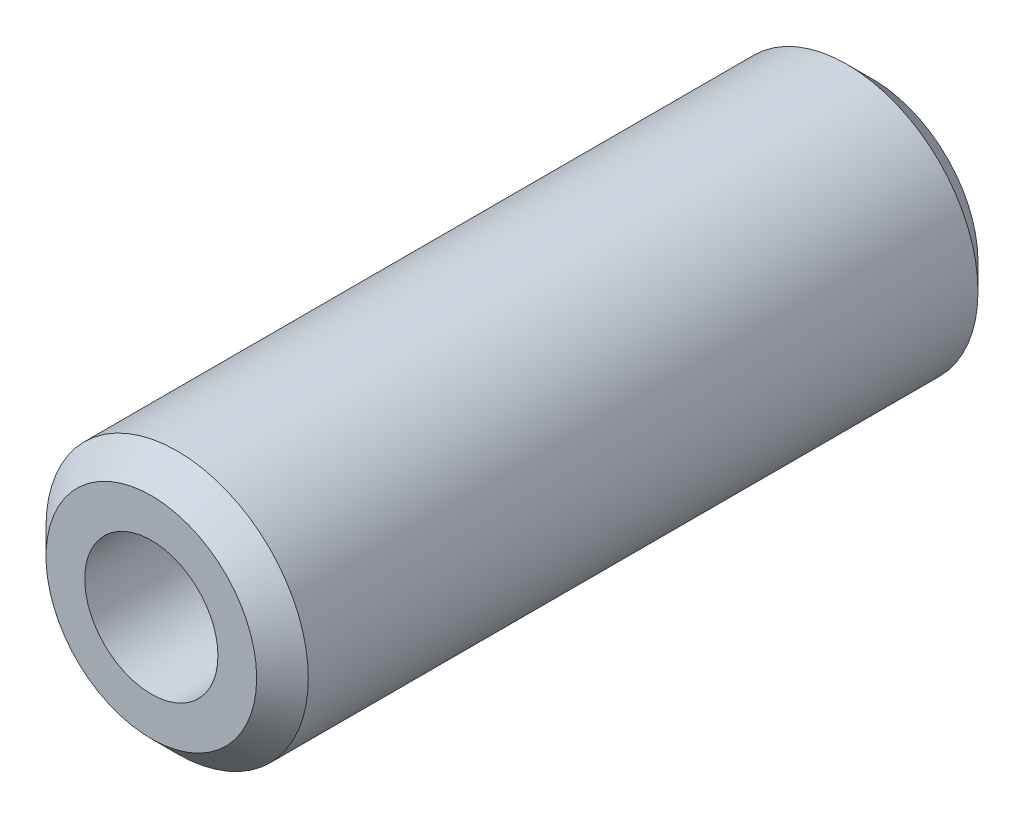
ISO-10303-21;
HEADER;
FILE_DESCRIPTION(('STEP AP214'),'2;1');
FILE_NAME('part.step','',(''),(''),'','','');
FILE_SCHEMA(('AUTOMOTIVE_DESIGN { 1 0 10303 214 1 1 1 1 }'));
ENDSEC;
DATA;
#1=APPLICATION_CONTEXT('core data for automotive mechanical design processes');
#2=APPLICATION_PROTOCOL_DEFINITION('international standard','automotive_design',2000,#1);
#3=PRODUCT_CONTEXT('',#1,'mechanical');
#4=PRODUCT('Part','Part','',(#3));
#5=PRODUCT_RELATED_PRODUCT_CATEGORY('part','',(#4));
#6=PRODUCT_DEFINITION_FORMATION('','',#4);
#7=PRODUCT_DEFINITION_CONTEXT('part definition',#1,'design');
#8=PRODUCT_DEFINITION('design','',#6,#7);
#9=PRODUCT_DEFINITION_SHAPE('','',#8);
#10=(LENGTH_UNIT() NAMED_UNIT(*) SI_UNIT(.MILLI.,.METRE.));
#11=(NAMED_UNIT(*) PLANE_ANGLE_UNIT() SI_UNIT($,.RADIAN.));
#12=(NAMED_UNIT(*) SI_UNIT($,.STERADIAN.) SOLID_ANGLE_UNIT());
#13=UNCERTAINTY_MEASURE_WITH_UNIT(LENGTH_MEASURE(1.E-05),#10,'distance_accuracy_value','');
#14=(GEOMETRIC_REPRESENTATION_CONTEXT(3) GLOBAL_UNCERTAINTY_ASSIGNED_CONTEXT((#13)) GLOBAL_UNIT_ASSIGNED_CONTEXT((#10,
#11,#12)) REPRESENTATION_CONTEXT('',''));
#15=CARTESIAN_POINT('',(0.,0.,0.));
#16=DIRECTION('',(0.,0.,1.));
#17=DIRECTION('',(1.,0.,0.));
#18=AXIS2_PLACEMENT_3D('',#15,#16,#17);
#19=CARTESIAN_POINT('',(0.,0.,69.85));
#20=DIRECTION('',(0.,0.,-1.));
#21=DIRECTION('',(-1.,0.,0.));
#22=AXIS2_PLACEMENT_3D('',#19,#20,#21);
#23=CYLINDRICAL_SURFACE('',#22,12.7);
#24=CARTESIAN_POINT('',(0.,0.,2.5));
#25=DIRECTION('',(0.,0.,1.));
#26=DIRECTION('',(1.,0.,0.));
#27=AXIS2_PLACEMENT_3D('',#24,#25,#26);
#28=CIRCLE('',#27,12.7);
#29=CARTESIAN_POINT('',(12.7,0.,2.5));
#30=VERTEX_POINT('',#29);
#31=EDGE_CURVE('E55',#30,#30,#28,.T.);
#32=ORIENTED_EDGE('',*,*,#31,.T.);
#33=EDGE_LOOP('',(#32));
#34=FACE_BOUND('',#33,.T.);
#35=CARTESIAN_POINT('',(0.,0.,67.35));
#36=DIRECTION('',(0.,0.,1.));
#37=DIRECTION('',(1.,0.,0.));
#38=AXIS2_PLACEMENT_3D('',#35,#36,#37);
#39=CIRCLE('',#38,12.7);
#40=CARTESIAN_POINT('',(12.7,0.,67.35));
#41=VERTEX_POINT('',#40);
#42=EDGE_CURVE('E59',#41,#41,#39,.F.);
#43=ORIENTED_EDGE('',*,*,#42,.T.);
#44=EDGE_LOOP('',(#43));
#45=FACE_BOUND('',#44,.T.);
#46=ADVANCED_FACE('F43',(#34,#45),#23,.T.);
#47=CARTESIAN_POINT('',(0.,0.,69.85));
#48=DIRECTION('',(0.,0.,1.));
#49=DIRECTION('',(1.,0.,0.));
#50=AXIS2_PLACEMENT_3D('',#47,#48,#49);
#51=PLANE('',#50);
#52=CARTESIAN_POINT('',(0.,0.,69.85));
#53=DIRECTION('',(0.,0.,1.));
#54=DIRECTION('',(1.,0.,0.));
#55=AXIS2_PLACEMENT_3D('',#52,#53,#54);
#56=CIRCLE('',#55,10.2);
#57=CARTESIAN_POINT('',(10.2,0.,69.85));
#58=VERTEX_POINT('',#57);
#59=EDGE_CURVE('E10',#58,#58,#56,.T.);
#60=ORIENTED_EDGE('',*,*,#59,.T.);
#61=EDGE_LOOP('',(#60));
#62=FACE_BOUND('',#61,.T.);
#63=CARTESIAN_POINT('',(0.,0.,69.85));
#64=DIRECTION('',(0.,0.,1.));
#65=DIRECTION('',(1.,0.,0.));
#66=AXIS2_PLACEMENT_3D('',#63,#64,#65);
#67=CIRCLE('',#66,6.45);
#68=CARTESIAN_POINT('',(6.45,0.,69.85));
#69=VERTEX_POINT('',#68);
#70=EDGE_CURVE('E65',#69,#69,#67,.T.);
#71=ORIENTED_EDGE('',*,*,#70,.F.);
#72=EDGE_LOOP('',(#71));
#73=FACE_BOUND('',#72,.T.);
#74=ADVANCED_FACE('F80',(#62,#73),#51,.T.);
#75=CARTESIAN_POINT('',(0.,0.,0.));
#76=DIRECTION('',(0.,0.,1.));
#77=DIRECTION('',(1.,0.,0.));
#78=AXIS2_PLACEMENT_3D('',#75,#76,#77);
#79=PLANE('',#78);
#80=CARTESIAN_POINT('',(0.,0.,0.));
#81=DIRECTION('',(0.,0.,1.));
#82=DIRECTION('',(1.,0.,0.));
#83=AXIS2_PLACEMENT_3D('',#80,#81,#82);
#84=CIRCLE('',#83,10.2);
#85=CARTESIAN_POINT('',(10.2,0.,0.));
#86=VERTEX_POINT('',#85);
#87=EDGE_CURVE('E51',#86,#86,#84,.F.);
#88=ORIENTED_EDGE('',*,*,#87,.T.);
#89=EDGE_LOOP('',(#88));
#90=FACE_BOUND('',#89,.T.);
#91=CARTESIAN_POINT('',(0.,0.,0.));
#92=DIRECTION('',(0.,0.,1.));
#93=DIRECTION('',(1.,0.,0.));
#94=AXIS2_PLACEMENT_3D('',#91,#92,#93);
#95=CIRCLE('',#94,6.45);
#96=CARTESIAN_POINT('',(6.45,0.,0.));
#97=VERTEX_POINT('',#96);
#98=EDGE_CURVE('E64',#97,#97,#95,.T.);
#99=ORIENTED_EDGE('',*,*,#98,.T.);
#100=EDGE_LOOP('',(#99));
#101=FACE_BOUND('',#100,.T.);
#102=ADVANCED_FACE('F71',(#90,#101),#79,.F.);
#103=CARTESIAN_POINT('',(0.,0.,0.));
#104=DIRECTION('',(0.,0.,1.));
#105=DIRECTION('',(1.,0.,0.));
#106=AXIS2_PLACEMENT_3D('',#103,#104,#105);
#107=CYLINDRICAL_SURFACE('',#106,6.45);
#108=ORIENTED_EDGE('',*,*,#98,.F.);
#109=EDGE_LOOP('',(#108));
#110=FACE_BOUND('',#109,.T.);
#111=ORIENTED_EDGE('',*,*,#70,.T.);
#112=EDGE_LOOP('',(#111));
#113=FACE_BOUND('',#112,.T.);
#114=ADVANCED_FACE('F73',(#110,#113),#107,.F.);
#115=CARTESIAN_POINT('',(0.,0.,2.5));
#116=DIRECTION('',(0.,0.,1.));
#117=DIRECTION('',(1.,0.,0.));
#118=AXIS2_PLACEMENT_3D('',#115,#116,#117);
#119=CONICAL_SURFACE('',#118,12.7,0.785398163397453);
#120=ORIENTED_EDGE('',*,*,#87,.F.);
#121=EDGE_LOOP('',(#120));
#122=FACE_BOUND('',#121,.T.);
#123=ORIENTED_EDGE('',*,*,#31,.F.);
#124=EDGE_LOOP('',(#123));
#125=FACE_BOUND('',#124,.T.);
#126=ADVANCED_FACE('F76',(#122,#125),#119,.T.);
#127=CARTESIAN_POINT('',(0.,0.,69.85));
#128=DIRECTION('',(0.,0.,-1.));
#129=DIRECTION('',(-1.,0.,0.));
#130=AXIS2_PLACEMENT_3D('',#127,#128,#129);
#131=CONICAL_SURFACE('',#130,10.2,0.785398163397448);
#132=ORIENTED_EDGE('',*,*,#42,.F.);
#133=EDGE_LOOP('',(#132));
#134=FACE_BOUND('',#133,.T.);
#135=ORIENTED_EDGE('',*,*,#59,.F.);
#136=EDGE_LOOP('',(#135));
#137=FACE_BOUND('',#136,.T.);
#138=ADVANCED_FACE('F46',(#134,#137),#131,.T.);
#139=CLOSED_SHELL('',(#46,#74,#102,#114,#126,#138));
#140=MANIFOLD_SOLID_BREP('B2',#139);
#141=ADVANCED_BREP_SHAPE_REPRESENTATION('',(#18,#140),#14);
#142=SHAPE_DEFINITION_REPRESENTATION(#9,#141);
ENDSEC;
END-ISO-10303-21;
